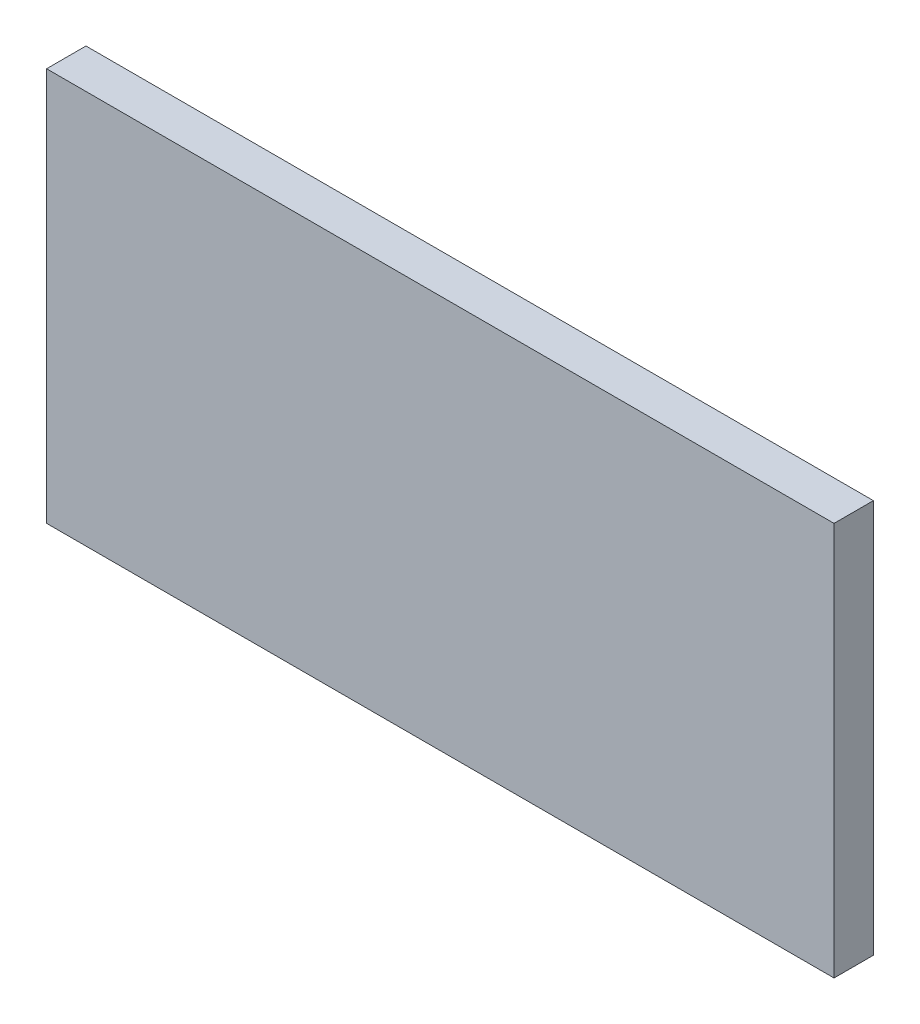
ISO-10303-21;
HEADER;
FILE_DESCRIPTION(('STEP AP214'),'2;1');
FILE_NAME('part.step','',(''),(''),'','','');
FILE_SCHEMA(('AUTOMOTIVE_DESIGN { 1 0 10303 214 1 1 1 1 }'));
ENDSEC;
DATA;
#1=APPLICATION_CONTEXT('core data for automotive mechanical design processes');
#2=APPLICATION_PROTOCOL_DEFINITION('international standard','automotive_design',2000,#1);
#3=PRODUCT_CONTEXT('',#1,'mechanical');
#4=PRODUCT('Part','Part','',(#3));
#5=PRODUCT_RELATED_PRODUCT_CATEGORY('part','',(#4));
#6=PRODUCT_DEFINITION_FORMATION('','',#4);
#7=PRODUCT_DEFINITION_CONTEXT('part definition',#1,'design');
#8=PRODUCT_DEFINITION('design','',#6,#7);
#9=PRODUCT_DEFINITION_SHAPE('','',#8);
#10=(LENGTH_UNIT() NAMED_UNIT(*) SI_UNIT(.MILLI.,.METRE.));
#11=(NAMED_UNIT(*) PLANE_ANGLE_UNIT() SI_UNIT($,.RADIAN.));
#12=(NAMED_UNIT(*) SI_UNIT($,.STERADIAN.) SOLID_ANGLE_UNIT());
#13=UNCERTAINTY_MEASURE_WITH_UNIT(LENGTH_MEASURE(1.E-05),#10,'distance_accuracy_value','');
#14=(GEOMETRIC_REPRESENTATION_CONTEXT(3) GLOBAL_UNCERTAINTY_ASSIGNED_CONTEXT((#13)) GLOBAL_UNIT_ASSIGNED_CONTEXT((#10,
#11,#12)) REPRESENTATION_CONTEXT('',''));
#15=CARTESIAN_POINT('',(0.,0.,0.));
#16=DIRECTION('',(0.,0.,1.));
#17=DIRECTION('',(1.,0.,0.));
#18=AXIS2_PLACEMENT_3D('',#15,#16,#17);
#19=CARTESIAN_POINT('',(12.7,-6.35,1.27));
#20=DIRECTION('',(-1.,0.,0.));
#21=DIRECTION('',(0.,0.,1.));
#22=AXIS2_PLACEMENT_3D('',#19,#20,#21);
#23=PLANE('',#22);
#24=DIRECTION('',(0.,1.,0.));
#25=VECTOR('',#24,1.);
#26=CARTESIAN_POINT('',(12.7,-6.35,0.));
#27=LINE('',#26,#25);
#28=CARTESIAN_POINT('',(12.7,-6.35,0.));
#29=VERTEX_POINT('',#28);
#30=CARTESIAN_POINT('',(12.7,6.35,0.));
#31=VERTEX_POINT('',#30);
#32=EDGE_CURVE('E108',#29,#31,#27,.T.);
#33=ORIENTED_EDGE('',*,*,#32,.T.);
#34=DIRECTION('',(0.,0.,-1.));
#35=VECTOR('',#34,1.);
#36=CARTESIAN_POINT('',(12.7,6.35,1.27));
#37=LINE('',#36,#35);
#38=CARTESIAN_POINT('',(12.7,6.35,1.27));
#39=VERTEX_POINT('',#38);
#40=EDGE_CURVE('E11',#39,#31,#37,.T.);
#41=ORIENTED_EDGE('',*,*,#40,.F.);
#42=DIRECTION('',(0.,1.,0.));
#43=VECTOR('',#42,1.);
#44=CARTESIAN_POINT('',(12.7,-6.35,1.27));
#45=LINE('',#44,#43);
#46=CARTESIAN_POINT('',(12.7,-6.35,1.27));
#47=VERTEX_POINT('',#46);
#48=EDGE_CURVE('E96',#47,#39,#45,.T.);
#49=ORIENTED_EDGE('',*,*,#48,.F.);
#50=DIRECTION('',(0.,0.,-1.));
#51=VECTOR('',#50,1.);
#52=CARTESIAN_POINT('',(12.7,-6.35,1.27));
#53=LINE('',#52,#51);
#54=EDGE_CURVE('E104',#47,#29,#53,.T.);
#55=ORIENTED_EDGE('',*,*,#54,.T.);
#56=EDGE_LOOP('',(#33,#41,#49,#55));
#57=FACE_BOUND('',#56,.T.);
#58=ADVANCED_FACE('F45',(#57),#23,.F.);
#59=CARTESIAN_POINT('',(-12.7,6.35,1.27));
#60=DIRECTION('',(0.,-1.,0.));
#61=DIRECTION('',(0.,0.,-1.));
#62=AXIS2_PLACEMENT_3D('',#59,#60,#61);
#63=PLANE('',#62);
#64=DIRECTION('',(-1.,0.,0.));
#65=VECTOR('',#64,1.);
#66=CARTESIAN_POINT('',(-12.7,6.35,0.));
#67=LINE('',#66,#65);
#68=CARTESIAN_POINT('',(-12.7,6.35,0.));
#69=VERTEX_POINT('',#68);
#70=EDGE_CURVE('E100',#31,#69,#67,.T.);
#71=ORIENTED_EDGE('',*,*,#70,.T.);
#72=DIRECTION('',(0.,0.,-1.));
#73=VECTOR('',#72,1.);
#74=CARTESIAN_POINT('',(-12.7,6.35,1.27));
#75=LINE('',#74,#73);
#76=CARTESIAN_POINT('',(-12.7,6.35,1.27));
#77=VERTEX_POINT('',#76);
#78=EDGE_CURVE('E53',#77,#69,#75,.T.);
#79=ORIENTED_EDGE('',*,*,#78,.F.);
#80=DIRECTION('',(-1.,0.,0.));
#81=VECTOR('',#80,1.);
#82=CARTESIAN_POINT('',(-12.7,6.35,1.27));
#83=LINE('',#82,#81);
#84=EDGE_CURVE('E91',#39,#77,#83,.T.);
#85=ORIENTED_EDGE('',*,*,#84,.F.);
#86=ORIENTED_EDGE('',*,*,#40,.T.);
#87=EDGE_LOOP('',(#71,#79,#85,#86));
#88=FACE_BOUND('',#87,.T.);
#89=ADVANCED_FACE('F99',(#88),#63,.F.);
#90=CARTESIAN_POINT('',(-12.7,-6.35,1.27));
#91=DIRECTION('',(1.,0.,0.));
#92=DIRECTION('',(0.,0.,-1.));
#93=AXIS2_PLACEMENT_3D('',#90,#91,#92);
#94=PLANE('',#93);
#95=DIRECTION('',(0.,-1.,0.));
#96=VECTOR('',#95,1.);
#97=CARTESIAN_POINT('',(-12.7,-6.35,0.));
#98=LINE('',#97,#96);
#99=CARTESIAN_POINT('',(-12.7,-6.35,0.));
#100=VERTEX_POINT('',#99);
#101=EDGE_CURVE('E78',#69,#100,#98,.T.);
#102=ORIENTED_EDGE('',*,*,#101,.T.);
#103=DIRECTION('',(0.,0.,-1.));
#104=VECTOR('',#103,1.);
#105=CARTESIAN_POINT('',(-12.7,-6.35,1.27));
#106=LINE('',#105,#104);
#107=CARTESIAN_POINT('',(-12.7,-6.35,1.27));
#108=VERTEX_POINT('',#107);
#109=EDGE_CURVE('E101',#108,#100,#106,.T.);
#110=ORIENTED_EDGE('',*,*,#109,.F.);
#111=DIRECTION('',(0.,-1.,0.));
#112=VECTOR('',#111,1.);
#113=CARTESIAN_POINT('',(-12.7,-6.35,1.27));
#114=LINE('',#113,#112);
#115=EDGE_CURVE('E94',#77,#108,#114,.T.);
#116=ORIENTED_EDGE('',*,*,#115,.F.);
#117=ORIENTED_EDGE('',*,*,#78,.T.);
#118=EDGE_LOOP('',(#102,#110,#116,#117));
#119=FACE_BOUND('',#118,.T.);
#120=ADVANCED_FACE('F102',(#119),#94,.F.);
#121=CARTESIAN_POINT('',(-12.7,-6.35,1.27));
#122=DIRECTION('',(0.,1.,0.));
#123=DIRECTION('',(0.,0.,1.));
#124=AXIS2_PLACEMENT_3D('',#121,#122,#123);
#125=PLANE('',#124);
#126=DIRECTION('',(1.,0.,0.));
#127=VECTOR('',#126,1.);
#128=CARTESIAN_POINT('',(-12.7,-6.35,0.));
#129=LINE('',#128,#127);
#130=EDGE_CURVE('E84',#100,#29,#129,.T.);
#131=ORIENTED_EDGE('',*,*,#130,.T.);
#132=ORIENTED_EDGE('',*,*,#54,.F.);
#133=DIRECTION('',(1.,0.,0.));
#134=VECTOR('',#133,1.);
#135=CARTESIAN_POINT('',(-12.7,-6.35,1.27));
#136=LINE('',#135,#134);
#137=EDGE_CURVE('E61',#108,#47,#136,.T.);
#138=ORIENTED_EDGE('',*,*,#137,.F.);
#139=ORIENTED_EDGE('',*,*,#109,.T.);
#140=EDGE_LOOP('',(#131,#132,#138,#139));
#141=FACE_BOUND('',#140,.T.);
#142=ADVANCED_FACE('F115',(#141),#125,.F.);
#143=CARTESIAN_POINT('',(0.,0.,1.27));
#144=DIRECTION('',(0.,0.,-1.));
#145=DIRECTION('',(-1.,0.,0.));
#146=AXIS2_PLACEMENT_3D('',#143,#144,#145);
#147=PLANE('',#146);
#148=ORIENTED_EDGE('',*,*,#48,.T.);
#149=ORIENTED_EDGE('',*,*,#84,.T.);
#150=ORIENTED_EDGE('',*,*,#115,.T.);
#151=ORIENTED_EDGE('',*,*,#137,.T.);
#152=EDGE_LOOP('',(#148,#149,#150,#151));
#153=FACE_BOUND('',#152,.T.);
#154=ADVANCED_FACE('F92',(#153),#147,.F.);
#155=CARTESIAN_POINT('',(0.,0.,0.));
#156=DIRECTION('',(0.,0.,-1.));
#157=DIRECTION('',(-1.,0.,0.));
#158=AXIS2_PLACEMENT_3D('',#155,#156,#157);
#159=PLANE('',#158);
#160=ORIENTED_EDGE('',*,*,#32,.F.);
#161=ORIENTED_EDGE('',*,*,#130,.F.);
#162=ORIENTED_EDGE('',*,*,#101,.F.);
#163=ORIENTED_EDGE('',*,*,#70,.F.);
#164=EDGE_LOOP('',(#160,#161,#162,#163));
#165=FACE_BOUND('',#164,.T.);
#166=ADVANCED_FACE('F118',(#165),#159,.T.);
#167=CLOSED_SHELL('',(#58,#89,#120,#142,#154,#166));
#168=MANIFOLD_SOLID_BREP('B2',#167);
#169=ADVANCED_BREP_SHAPE_REPRESENTATION('',(#18,#168),#14);
#170=SHAPE_DEFINITION_REPRESENTATION(#9,#169);
ENDSEC;
END-ISO-10303-21;
